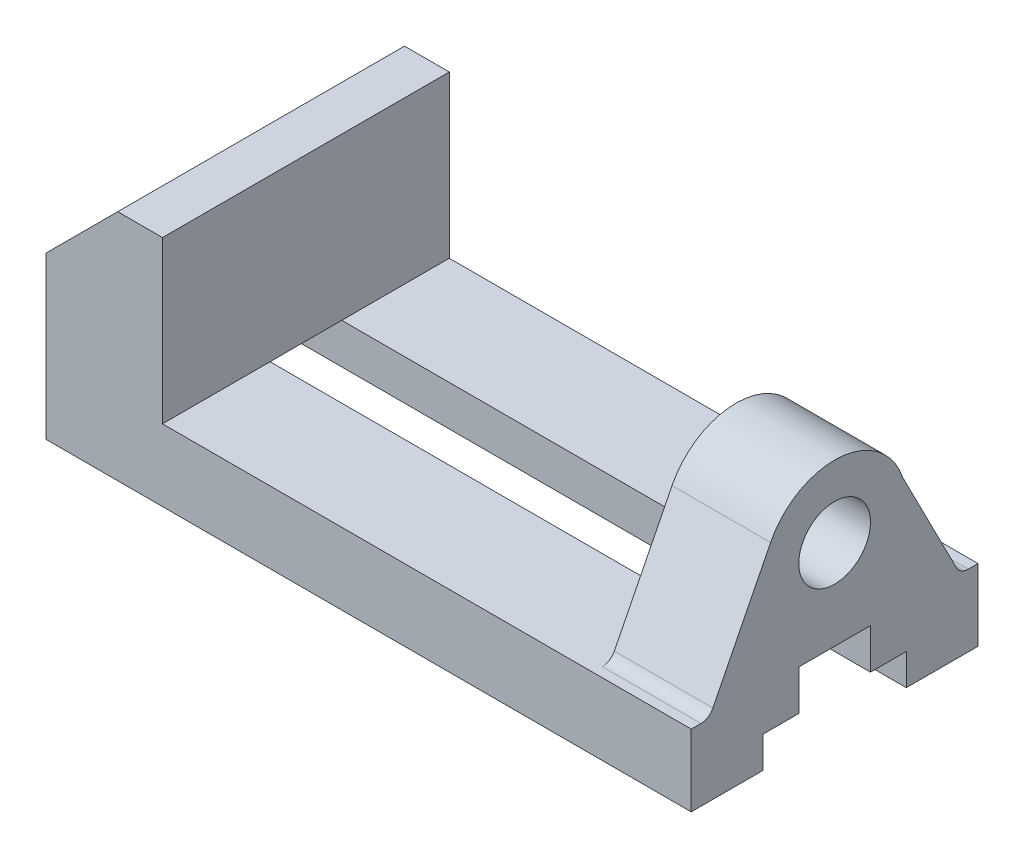
ISO-10303-21;
HEADER;
FILE_DESCRIPTION(('STEP AP214'),'2;1');
FILE_NAME('part.step','',(''),(''),'','','');
FILE_SCHEMA(('AUTOMOTIVE_DESIGN { 1 0 10303 214 1 1 1 1 }'));
ENDSEC;
DATA;
#1=APPLICATION_CONTEXT('core data for automotive mechanical design processes');
#2=APPLICATION_PROTOCOL_DEFINITION('international standard','automotive_design',2000,#1);
#3=PRODUCT_CONTEXT('',#1,'mechanical');
#4=PRODUCT('Part','Part','',(#3));
#5=PRODUCT_RELATED_PRODUCT_CATEGORY('part','',(#4));
#6=PRODUCT_DEFINITION_FORMATION('','',#4);
#7=PRODUCT_DEFINITION_CONTEXT('part definition',#1,'design');
#8=PRODUCT_DEFINITION('design','',#6,#7);
#9=PRODUCT_DEFINITION_SHAPE('','',#8);
#10=(LENGTH_UNIT() NAMED_UNIT(*) SI_UNIT(.MILLI.,.METRE.));
#11=(NAMED_UNIT(*) PLANE_ANGLE_UNIT() SI_UNIT($,.RADIAN.));
#12=(NAMED_UNIT(*) SI_UNIT($,.STERADIAN.) SOLID_ANGLE_UNIT());
#13=UNCERTAINTY_MEASURE_WITH_UNIT(LENGTH_MEASURE(1.E-05),#10,'distance_accuracy_value','');
#14=(GEOMETRIC_REPRESENTATION_CONTEXT(3) GLOBAL_UNCERTAINTY_ASSIGNED_CONTEXT((#13)) GLOBAL_UNIT_ASSIGNED_CONTEXT((#10,
#11,#12)) REPRESENTATION_CONTEXT('',''));
#15=CARTESIAN_POINT('',(0.,0.,0.));
#16=DIRECTION('',(0.,0.,1.));
#17=DIRECTION('',(1.,0.,0.));
#18=AXIS2_PLACEMENT_3D('',#15,#16,#17);
#19=CARTESIAN_POINT('',(-72.,-26.,64.));
#20=DIRECTION('',(0.,1.,0.));
#21=DIRECTION('',(0.,0.,1.));
#22=AXIS2_PLACEMENT_3D('',#19,#20,#21);
#23=PLANE('',#22);
#24=CARTESIAN_POINT('',(-36.,-26.,56.));
#25=DIRECTION('',(0.,-1.,0.));
#26=DIRECTION('',(0.,0.,-1.));
#27=AXIS2_PLACEMENT_3D('',#24,#25,#26);
#28=CIRCLE('',#27,2.99999999999999);
#29=CARTESIAN_POINT('',(-36.,-26.,53.));
#30=VERTEX_POINT('',#29);
#31=EDGE_CURVE('E260',#30,#30,#28,.T.);
#32=ORIENTED_EDGE('',*,*,#31,.F.);
#33=EDGE_LOOP('',(#32));
#34=FACE_BOUND('',#33,.T.);
#35=CARTESIAN_POINT('',(34.,-26.,56.));
#36=DIRECTION('',(0.,-1.,0.));
#37=DIRECTION('',(0.,0.,-1.));
#38=AXIS2_PLACEMENT_3D('',#35,#36,#37);
#39=CIRCLE('',#38,2.99999999999999);
#40=CARTESIAN_POINT('',(34.,-26.,53.));
#41=VERTEX_POINT('',#40);
#42=EDGE_CURVE('E266',#41,#41,#39,.T.);
#43=ORIENTED_EDGE('',*,*,#42,.F.);
#44=EDGE_LOOP('',(#43));
#45=FACE_BOUND('',#44,.T.);
#46=DIRECTION('',(1.,0.,0.));
#47=VECTOR('',#46,1.);
#48=CARTESIAN_POINT('',(-72.,-26.,48.));
#49=LINE('',#48,#47);
#50=CARTESIAN_POINT('',(-72.,-26.,48.));
#51=VERTEX_POINT('',#50);
#52=CARTESIAN_POINT('',(72.,-26.,48.));
#53=VERTEX_POINT('',#52);
#54=EDGE_CURVE('E331',#51,#53,#49,.T.);
#55=ORIENTED_EDGE('',*,*,#54,.T.);
#56=DIRECTION('',(0.,0.,-1.));
#57=VECTOR('',#56,1.);
#58=CARTESIAN_POINT('',(72.,-26.,64.));
#59=LINE('',#58,#57);
#60=CARTESIAN_POINT('',(72.,-26.,64.));
#61=VERTEX_POINT('',#60);
#62=EDGE_CURVE('E411',#61,#53,#59,.T.);
#63=ORIENTED_EDGE('',*,*,#62,.F.);
#64=DIRECTION('',(1.,0.,0.));
#65=VECTOR('',#64,1.);
#66=CARTESIAN_POINT('',(-72.,-26.,64.));
#67=LINE('',#66,#65);
#68=CARTESIAN_POINT('',(-72.,-26.,64.));
#69=VERTEX_POINT('',#68);
#70=EDGE_CURVE('E399',#69,#61,#67,.T.);
#71=ORIENTED_EDGE('',*,*,#70,.F.);
#72=DIRECTION('',(0.,0.,-1.));
#73=VECTOR('',#72,1.);
#74=CARTESIAN_POINT('',(-72.,-26.,64.));
#75=LINE('',#74,#73);
#76=EDGE_CURVE('E415',#69,#51,#75,.T.);
#77=ORIENTED_EDGE('',*,*,#76,.T.);
#78=EDGE_LOOP('',(#55,#63,#71,#77));
#79=FACE_BOUND('',#78,.T.);
#80=ADVANCED_FACE('F74',(#34,#45,#79),#23,.F.);
#81=CARTESIAN_POINT('',(-46.,-10.,0.));
#82=DIRECTION('',(0.,-1.,0.));
#83=DIRECTION('',(0.,0.,-1.));
#84=AXIS2_PLACEMENT_3D('',#81,#82,#83);
#85=PLANE('',#84);
#86=DIRECTION('',(0.,0.,1.));
#87=VECTOR('',#86,1.);
#88=CARTESIAN_POINT('',(50.,-10.,0.));
#89=LINE('',#88,#87);
#90=CARTESIAN_POINT('',(50.,-10.,2.1648257707599));
#91=VERTEX_POINT('',#90);
#92=CARTESIAN_POINT('',(50.,-9.99999999999999,24.));
#93=VERTEX_POINT('',#92);
#94=EDGE_CURVE('E380',#91,#93,#89,.T.);
#95=ORIENTED_EDGE('',*,*,#94,.F.);
#96=DIRECTION('',(1.,0.,0.));
#97=VECTOR('',#96,1.);
#98=CARTESIAN_POINT('',(-46.,-10.,2.1648257707599));
#99=LINE('',#98,#97);
#100=CARTESIAN_POINT('',(72.,-9.99999999999851,2.1648257707599));
#101=VERTEX_POINT('',#100);
#102=EDGE_CURVE('E421',#91,#101,#99,.T.);
#103=ORIENTED_EDGE('',*,*,#102,.T.);
#104=DIRECTION('',(0.,0.,1.));
#105=VECTOR('',#104,1.);
#106=CARTESIAN_POINT('',(72.,-9.99999999999851,0.));
#107=LINE('',#106,#105);
#108=CARTESIAN_POINT('',(72.,-9.99999999999851,0.));
#109=VERTEX_POINT('',#108);
#110=EDGE_CURVE('E361',#109,#101,#107,.T.);
#111=ORIENTED_EDGE('',*,*,#110,.F.);
#112=DIRECTION('',(1.,0.,0.));
#113=VECTOR('',#112,1.);
#114=CARTESIAN_POINT('',(-46.,-10.,0.));
#115=LINE('',#114,#113);
#116=CARTESIAN_POINT('',(-46.,-10.,0.));
#117=VERTEX_POINT('',#116);
#118=EDGE_CURVE('E373',#117,#109,#115,.T.);
#119=ORIENTED_EDGE('',*,*,#118,.F.);
#120=DIRECTION('',(0.,0.,1.));
#121=VECTOR('',#120,1.);
#122=CARTESIAN_POINT('',(-46.,-10.,0.));
#123=LINE('',#122,#121);
#124=CARTESIAN_POINT('',(-46.,-10.,24.));
#125=VERTEX_POINT('',#124);
#126=EDGE_CURVE('E384',#117,#125,#123,.T.);
#127=ORIENTED_EDGE('',*,*,#126,.T.);
#128=DIRECTION('',(1.,0.,0.));
#129=VECTOR('',#128,1.);
#130=CARTESIAN_POINT('',(-72.,-9.99999999999999,24.));
#131=LINE('',#130,#129);
#132=EDGE_CURVE('E323',#125,#93,#131,.T.);
#133=ORIENTED_EDGE('',*,*,#132,.T.);
#134=EDGE_LOOP('',(#95,#103,#111,#119,#127,#133));
#135=FACE_BOUND('',#134,.T.);
#136=ADVANCED_FACE('F447',(#135),#85,.F.);
#137=CARTESIAN_POINT('',(72.,26.,64.));
#138=DIRECTION('',(-1.,0.,0.));
#139=DIRECTION('',(0.,0.,1.));
#140=AXIS2_PLACEMENT_3D('',#137,#138,#139);
#141=PLANE('',#140);
#142=DIRECTION('',(0.,0.,1.));
#143=VECTOR('',#142,1.);
#144=CARTESIAN_POINT('',(72.,-19.,0.));
#145=LINE('',#144,#143);
#146=CARTESIAN_POINT('',(72.,-19.,16.));
#147=VERTEX_POINT('',#146);
#148=CARTESIAN_POINT('',(72.,-19.,24.));
#149=VERTEX_POINT('',#148);
#150=EDGE_CURVE('E312',#147,#149,#145,.T.);
#151=ORIENTED_EDGE('',*,*,#150,.F.);
#152=DIRECTION('',(0.,1.,0.));
#153=VECTOR('',#152,1.);
#154=CARTESIAN_POINT('',(72.,0.,16.));
#155=LINE('',#154,#153);
#156=CARTESIAN_POINT('',(72.,-26.,16.));
#157=VERTEX_POINT('',#156);
#158=EDGE_CURVE('E315',#157,#147,#155,.T.);
#159=ORIENTED_EDGE('',*,*,#158,.F.);
#160=CARTESIAN_POINT('',(72.,-26.,0.));
#161=VERTEX_POINT('',#160);
#162=EDGE_CURVE('E401',#157,#161,#59,.T.);
#163=ORIENTED_EDGE('',*,*,#162,.T.);
#164=DIRECTION('',(0.,1.,0.));
#165=VECTOR('',#164,1.);
#166=CARTESIAN_POINT('',(72.,26.,0.));
#167=LINE('',#166,#165);
#168=EDGE_CURVE('E383',#161,#109,#167,.T.);
#169=ORIENTED_EDGE('',*,*,#168,.T.);
#170=ORIENTED_EDGE('',*,*,#110,.T.);
#171=CARTESIAN_POINT('',(72.,-7.,2.1648257707599));
#172=DIRECTION('',(-1.,0.,0.));
#173=DIRECTION('',(0.,0.,1.));
#174=AXIS2_PLACEMENT_3D('',#171,#172,#173);
#175=CIRCLE('',#174,3.);
#176=CARTESIAN_POINT('',(72.,-8.36615393147599,4.83571016277553));
#177=VERTEX_POINT('',#176);
#178=EDGE_CURVE('E433',#101,#177,#175,.T.);
#179=ORIENTED_EDGE('',*,*,#178,.T.);
#180=DIRECTION('',(0.,0.890294797338543,0.455384643825331));
#181=VECTOR('',#180,1.);
#182=CARTESIAN_POINT('',(72.,-3.69545805507138,7.22476509654726));
#183=LINE('',#182,#181);
#184=CARTESIAN_POINT('',(72.,15.0770580004035,16.8268829154802));
#185=VERTEX_POINT('',#184);
#186=EDGE_CURVE('E359',#177,#185,#183,.T.);
#187=ORIENTED_EDGE('',*,*,#186,.T.);
#188=CARTESIAN_POINT('',(72.,10.0000000000116,31.9999999999906));
#189=DIRECTION('',(1.,0.,0.));
#190=DIRECTION('',(0.,0.,-1.));
#191=AXIS2_PLACEMENT_3D('',#188,#189,#190);
#192=CIRCLE('',#191,15.9999999999876);
#193=CARTESIAN_POINT('',(72.,17.2022511872648,46.2873222765874));
#194=VERTEX_POINT('',#193);
#195=EDGE_CURVE('E356',#185,#194,#192,.T.);
#196=ORIENTED_EDGE('',*,*,#195,.T.);
#197=DIRECTION('',(0.,0.892957642287946,-0.450140699203651));
#198=VECTOR('',#197,1.);
#199=CARTESIAN_POINT('',(72.,22.091128156727,43.8228352806357));
#200=LINE('',#199,#198);
#201=CARTESIAN_POINT('',(72.,-8.35042209761096,59.1684463907224));
#202=VERTEX_POINT('',#201);
#203=EDGE_CURVE('E346',#202,#194,#200,.T.);
#204=ORIENTED_EDGE('',*,*,#203,.F.);
#205=CARTESIAN_POINT('',(72.,-7.,61.8473193175863));
#206=DIRECTION('',(-1.,0.,0.));
#207=DIRECTION('',(0.,0.,1.));
#208=AXIS2_PLACEMENT_3D('',#205,#206,#207);
#209=CIRCLE('',#208,3.);
#210=CARTESIAN_POINT('',(72.,-9.99999999999852,61.8473193175863));
#211=VERTEX_POINT('',#210);
#212=EDGE_CURVE('E82',#202,#211,#209,.T.);
#213=ORIENTED_EDGE('',*,*,#212,.T.);
#214=DIRECTION('',(0.,0.,-1.));
#215=VECTOR('',#214,1.);
#216=CARTESIAN_POINT('',(72.,-9.99999999999852,0.));
#217=LINE('',#216,#215);
#218=CARTESIAN_POINT('',(72.,-9.99999999999852,64.));
#219=VERTEX_POINT('',#218);
#220=EDGE_CURVE('E348',#219,#211,#217,.T.);
#221=ORIENTED_EDGE('',*,*,#220,.F.);
#222=DIRECTION('',(0.,1.,0.));
#223=VECTOR('',#222,1.);
#224=CARTESIAN_POINT('',(72.,26.,64.));
#225=LINE('',#224,#223);
#226=EDGE_CURVE('E390',#61,#219,#225,.T.);
#227=ORIENTED_EDGE('',*,*,#226,.F.);
#228=ORIENTED_EDGE('',*,*,#62,.T.);
#229=DIRECTION('',(0.,1.,0.));
#230=VECTOR('',#229,1.);
#231=CARTESIAN_POINT('',(72.,0.,48.));
#232=LINE('',#231,#230);
#233=CARTESIAN_POINT('',(72.,-19.,48.));
#234=VERTEX_POINT('',#233);
#235=EDGE_CURVE('E311',#53,#234,#232,.T.);
#236=ORIENTED_EDGE('',*,*,#235,.T.);
#237=CARTESIAN_POINT('',(72.,-19.,40.));
#238=VERTEX_POINT('',#237);
#239=EDGE_CURVE('E308',#238,#234,#145,.T.);
#240=ORIENTED_EDGE('',*,*,#239,.F.);
#241=DIRECTION('',(0.,-1.,0.));
#242=VECTOR('',#241,1.);
#243=CARTESIAN_POINT('',(72.,0.,40.));
#244=LINE('',#243,#242);
#245=CARTESIAN_POINT('',(72.,-9.99999999999999,40.));
#246=VERTEX_POINT('',#245);
#247=EDGE_CURVE('E305',#246,#238,#244,.T.);
#248=ORIENTED_EDGE('',*,*,#247,.F.);
#249=DIRECTION('',(0.,0.,1.));
#250=VECTOR('',#249,1.);
#251=CARTESIAN_POINT('',(72.,-9.99999999999999,0.));
#252=LINE('',#251,#250);
#253=CARTESIAN_POINT('',(72.,-9.99999999999999,24.));
#254=VERTEX_POINT('',#253);
#255=EDGE_CURVE('E281',#254,#246,#252,.T.);
#256=ORIENTED_EDGE('',*,*,#255,.F.);
#257=DIRECTION('',(0.,1.,0.));
#258=VECTOR('',#257,1.);
#259=CARTESIAN_POINT('',(72.,0.,24.));
#260=LINE('',#259,#258);
#261=EDGE_CURVE('E287',#149,#254,#260,.T.);
#262=ORIENTED_EDGE('',*,*,#261,.F.);
#263=EDGE_LOOP('',(#151,#159,#163,#169,#170,#179,#187,#196,#204,#213,#221,#227,#228,#236,#240,
#248,#256,#262));
#264=FACE_BOUND('',#263,.T.);
#265=CARTESIAN_POINT('',(72.,10.0000000000116,31.9999999999906));
#266=DIRECTION('',(1.,0.,0.));
#267=DIRECTION('',(0.,0.,-1.));
#268=AXIS2_PLACEMENT_3D('',#265,#266,#267);
#269=CIRCLE('',#268,7.99999999998763);
#270=CARTESIAN_POINT('',(72.,10.0000000000116,24.000000000003));
#271=VERTEX_POINT('',#270);
#272=EDGE_CURVE('E343',#271,#271,#269,.T.);
#273=ORIENTED_EDGE('',*,*,#272,.F.);
#274=EDGE_LOOP('',(#273));
#275=FACE_BOUND('',#274,.T.);
#276=ADVANCED_FACE('F450',(#264,#275),#141,.F.);
#277=CARTESIAN_POINT('',(0.,0.,0.));
#278=DIRECTION('',(0.,0.,1.));
#279=DIRECTION('',(1.,0.,0.));
#280=AXIS2_PLACEMENT_3D('',#277,#278,#279);
#281=PLANE('',#280);
#282=DIRECTION('',(0.,-1.,0.));
#283=VECTOR('',#282,1.);
#284=CARTESIAN_POINT('',(-72.,26.,0.));
#285=LINE('',#284,#283);
#286=CARTESIAN_POINT('',(-72.,9.99999999999999,0.));
#287=VERTEX_POINT('',#286);
#288=CARTESIAN_POINT('',(-72.,-26.,0.));
#289=VERTEX_POINT('',#288);
#290=EDGE_CURVE('E407',#287,#289,#285,.T.);
#291=ORIENTED_EDGE('',*,*,#290,.F.);
#292=DIRECTION('',(0.707106781186547,0.707106781186548,0.));
#293=VECTOR('',#292,1.);
#294=CARTESIAN_POINT('',(-72.,9.99999999999999,0.));
#295=LINE('',#294,#293);
#296=CARTESIAN_POINT('',(-56.,26.,0.));
#297=VERTEX_POINT('',#296);
#298=EDGE_CURVE('E273',#287,#297,#295,.T.);
#299=ORIENTED_EDGE('',*,*,#298,.T.);
#300=DIRECTION('',(-1.,0.,0.));
#301=VECTOR('',#300,1.);
#302=CARTESIAN_POINT('',(-72.,26.,0.));
#303=LINE('',#302,#301);
#304=CARTESIAN_POINT('',(-46.,26.,0.));
#305=VERTEX_POINT('',#304);
#306=EDGE_CURVE('E404',#305,#297,#303,.T.);
#307=ORIENTED_EDGE('',*,*,#306,.F.);
#308=DIRECTION('',(0.,-1.,0.));
#309=VECTOR('',#308,1.);
#310=CARTESIAN_POINT('',(-46.,26.,0.));
#311=LINE('',#310,#309);
#312=EDGE_CURVE('E370',#305,#117,#311,.T.);
#313=ORIENTED_EDGE('',*,*,#312,.T.);
#314=ORIENTED_EDGE('',*,*,#118,.T.);
#315=ORIENTED_EDGE('',*,*,#168,.F.);
#316=DIRECTION('',(1.,0.,0.));
#317=VECTOR('',#316,1.);
#318=CARTESIAN_POINT('',(-72.,-26.,0.));
#319=LINE('',#318,#317);
#320=EDGE_CURVE('E394',#289,#161,#319,.T.);
#321=ORIENTED_EDGE('',*,*,#320,.F.);
#322=EDGE_LOOP('',(#291,#299,#307,#313,#314,#315,#321));
#323=FACE_BOUND('',#322,.T.);
#324=ADVANCED_FACE('F459',(#323),#281,.F.);
#325=CARTESIAN_POINT('',(50.,-10.,0.));
#326=DIRECTION('',(1.,0.,0.));
#327=DIRECTION('',(0.,0.,-1.));
#328=AXIS2_PLACEMENT_3D('',#325,#326,#327);
#329=PLANE('',#328);
#330=CARTESIAN_POINT('',(50.,10.0000000000116,31.9999999999906));
#331=DIRECTION('',(1.,0.,0.));
#332=DIRECTION('',(0.,0.,-1.));
#333=AXIS2_PLACEMENT_3D('',#330,#331,#332);
#334=CIRCLE('',#333,7.99999999998763);
#335=CARTESIAN_POINT('',(50.,10.0000000000116,24.000000000003));
#336=VERTEX_POINT('',#335);
#337=EDGE_CURVE('E355',#336,#336,#334,.T.);
#338=ORIENTED_EDGE('',*,*,#337,.T.);
#339=EDGE_LOOP('',(#338));
#340=FACE_BOUND('',#339,.T.);
#341=ORIENTED_EDGE('',*,*,#94,.T.);
#342=DIRECTION('',(0.,0.,1.));
#343=VECTOR('',#342,1.);
#344=CARTESIAN_POINT('',(50.,-10.,0.));
#345=LINE('',#344,#343);
#346=CARTESIAN_POINT('',(50.,-9.99999999999999,40.));
#347=VERTEX_POINT('',#346);
#348=EDGE_CURVE('E322',#93,#347,#345,.T.);
#349=ORIENTED_EDGE('',*,*,#348,.T.);
#350=CARTESIAN_POINT('',(50.,-10.,61.8473193175863));
#351=VERTEX_POINT('',#350);
#352=EDGE_CURVE('E88',#347,#351,#89,.T.);
#353=ORIENTED_EDGE('',*,*,#352,.T.);
#354=CARTESIAN_POINT('',(50.,-7.,61.8473193175863));
#355=DIRECTION('',(1.,0.,0.));
#356=DIRECTION('',(0.,0.,-1.));
#357=AXIS2_PLACEMENT_3D('',#354,#355,#356);
#358=CIRCLE('',#357,3.);
#359=CARTESIAN_POINT('',(50.,-8.35042209761095,59.1684463907224));
#360=VERTEX_POINT('',#359);
#361=EDGE_CURVE('E12',#351,#360,#358,.T.);
#362=ORIENTED_EDGE('',*,*,#361,.T.);
#363=DIRECTION('',(0.,0.892957642287946,-0.450140699203651));
#364=VECTOR('',#363,1.);
#365=CARTESIAN_POINT('',(50.,14.1173946475225,47.8424010552231));
#366=LINE('',#365,#364);
#367=CARTESIAN_POINT('',(50.,17.2022511872648,46.2873222765874));
#368=VERTEX_POINT('',#367);
#369=EDGE_CURVE('E353',#360,#368,#366,.T.);
#370=ORIENTED_EDGE('',*,*,#369,.T.);
#371=CARTESIAN_POINT('',(50.,10.0000000000116,31.9999999999906));
#372=DIRECTION('',(1.,0.,0.));
#373=DIRECTION('',(0.,0.,-1.));
#374=AXIS2_PLACEMENT_3D('',#371,#372,#373);
#375=CIRCLE('',#374,15.9999999999876);
#376=CARTESIAN_POINT('',(50.,15.0770580004035,16.8268829154802));
#377=VERTEX_POINT('',#376);
#378=EDGE_CURVE('E418',#377,#368,#375,.T.);
#379=ORIENTED_EDGE('',*,*,#378,.F.);
#380=DIRECTION('',(0.,0.890294797338543,0.455384643825331));
#381=VECTOR('',#380,1.);
#382=CARTESIAN_POINT('',(50.,-11.6217063167521,3.17049930469169));
#383=LINE('',#382,#381);
#384=CARTESIAN_POINT('',(50.,-8.36615393147599,4.83571016277553));
#385=VERTEX_POINT('',#384);
#386=EDGE_CURVE('E367',#385,#377,#383,.T.);
#387=ORIENTED_EDGE('',*,*,#386,.F.);
#388=CARTESIAN_POINT('',(50.,-7.,2.1648257707599));
#389=DIRECTION('',(1.,0.,0.));
#390=DIRECTION('',(0.,0.,-1.));
#391=AXIS2_PLACEMENT_3D('',#388,#389,#390);
#392=CIRCLE('',#391,3.);
#393=EDGE_CURVE('E435',#385,#91,#392,.T.);
#394=ORIENTED_EDGE('',*,*,#393,.T.);
#395=EDGE_LOOP('',(#341,#349,#353,#362,#370,#379,#387,#394));
#396=FACE_BOUND('',#395,.T.);
#397=ADVANCED_FACE('F440',(#340,#396),#329,.F.);
#398=CARTESIAN_POINT('',(-72.,26.,64.));
#399=DIRECTION('',(0.,-1.,0.));
#400=DIRECTION('',(0.,0.,-1.));
#401=AXIS2_PLACEMENT_3D('',#398,#399,#400);
#402=PLANE('',#401);
#403=ORIENTED_EDGE('',*,*,#306,.T.);
#404=DIRECTION('',(0.,0.,1.));
#405=VECTOR('',#404,1.);
#406=CARTESIAN_POINT('',(-56.,26.,0.));
#407=LINE('',#406,#405);
#408=CARTESIAN_POINT('',(-56.,26.,64.));
#409=VERTEX_POINT('',#408);
#410=EDGE_CURVE('E278',#297,#409,#407,.T.);
#411=ORIENTED_EDGE('',*,*,#410,.T.);
#412=DIRECTION('',(-1.,0.,0.));
#413=VECTOR('',#412,1.);
#414=CARTESIAN_POINT('',(-72.,26.,64.));
#415=LINE('',#414,#413);
#416=CARTESIAN_POINT('',(-46.,26.,64.));
#417=VERTEX_POINT('',#416);
#418=EDGE_CURVE('E393',#417,#409,#415,.T.);
#419=ORIENTED_EDGE('',*,*,#418,.F.);
#420=DIRECTION('',(0.,0.,1.));
#421=VECTOR('',#420,1.);
#422=CARTESIAN_POINT('',(-46.,26.,0.));
#423=LINE('',#422,#421);
#424=EDGE_CURVE('E376',#305,#417,#423,.T.);
#425=ORIENTED_EDGE('',*,*,#424,.F.);
#426=EDGE_LOOP('',(#403,#411,#419,#425));
#427=FACE_BOUND('',#426,.T.);
#428=ADVANCED_FACE('F524',(#427),#402,.F.);
#429=CARTESIAN_POINT('',(-72.,26.,64.));
#430=DIRECTION('',(1.,0.,0.));
#431=DIRECTION('',(0.,0.,-1.));
#432=AXIS2_PLACEMENT_3D('',#429,#430,#431);
#433=PLANE('',#432);
#434=DIRECTION('',(0.,-1.,0.));
#435=VECTOR('',#434,1.);
#436=CARTESIAN_POINT('',(-72.,26.,64.));
#437=LINE('',#436,#435);
#438=CARTESIAN_POINT('',(-72.,10.,64.));
#439=VERTEX_POINT('',#438);
#440=EDGE_CURVE('E397',#439,#69,#437,.T.);
#441=ORIENTED_EDGE('',*,*,#440,.F.);
#442=DIRECTION('',(0.,0.,1.));
#443=VECTOR('',#442,1.);
#444=CARTESIAN_POINT('',(-72.,9.99999999999999,0.));
#445=LINE('',#444,#443);
#446=EDGE_CURVE('E276',#287,#439,#445,.T.);
#447=ORIENTED_EDGE('',*,*,#446,.F.);
#448=ORIENTED_EDGE('',*,*,#290,.T.);
#449=CARTESIAN_POINT('',(-72.,-26.,16.));
#450=VERTEX_POINT('',#449);
#451=EDGE_CURVE('E414',#450,#289,#75,.T.);
#452=ORIENTED_EDGE('',*,*,#451,.F.);
#453=DIRECTION('',(0.,1.,0.));
#454=VECTOR('',#453,1.);
#455=CARTESIAN_POINT('',(-72.,0.,16.));
#456=LINE('',#455,#454);
#457=CARTESIAN_POINT('',(-72.,-19.,16.));
#458=VERTEX_POINT('',#457);
#459=EDGE_CURVE('E296',#450,#458,#456,.T.);
#460=ORIENTED_EDGE('',*,*,#459,.T.);
#461=DIRECTION('',(0.,0.,1.));
#462=VECTOR('',#461,1.);
#463=CARTESIAN_POINT('',(-72.,-19.,0.));
#464=LINE('',#463,#462);
#465=CARTESIAN_POINT('',(-72.,-19.,24.));
#466=VERTEX_POINT('',#465);
#467=EDGE_CURVE('E294',#458,#466,#464,.T.);
#468=ORIENTED_EDGE('',*,*,#467,.T.);
#469=DIRECTION('',(0.,1.,0.));
#470=VECTOR('',#469,1.);
#471=CARTESIAN_POINT('',(-72.,0.,24.));
#472=LINE('',#471,#470);
#473=CARTESIAN_POINT('',(-72.,-9.99999999999999,24.));
#474=VERTEX_POINT('',#473);
#475=EDGE_CURVE('E299',#466,#474,#472,.T.);
#476=ORIENTED_EDGE('',*,*,#475,.T.);
#477=DIRECTION('',(0.,0.,1.));
#478=VECTOR('',#477,1.);
#479=CARTESIAN_POINT('',(-72.,-9.99999999999999,0.));
#480=LINE('',#479,#478);
#481=CARTESIAN_POINT('',(-72.,-9.99999999999999,40.));
#482=VERTEX_POINT('',#481);
#483=EDGE_CURVE('E283',#474,#482,#480,.T.);
#484=ORIENTED_EDGE('',*,*,#483,.T.);
#485=DIRECTION('',(0.,-1.,0.));
#486=VECTOR('',#485,1.);
#487=CARTESIAN_POINT('',(-72.,0.,40.));
#488=LINE('',#487,#486);
#489=CARTESIAN_POINT('',(-72.,-19.,40.));
#490=VERTEX_POINT('',#489);
#491=EDGE_CURVE('E286',#482,#490,#488,.T.);
#492=ORIENTED_EDGE('',*,*,#491,.T.);
#493=CARTESIAN_POINT('',(-72.,-19.,48.));
#494=VERTEX_POINT('',#493);
#495=EDGE_CURVE('E290',#490,#494,#464,.T.);
#496=ORIENTED_EDGE('',*,*,#495,.T.);
#497=DIRECTION('',(0.,1.,0.));
#498=VECTOR('',#497,1.);
#499=CARTESIAN_POINT('',(-72.,0.,48.));
#500=LINE('',#499,#498);
#501=EDGE_CURVE('E293',#51,#494,#500,.T.);
#502=ORIENTED_EDGE('',*,*,#501,.F.);
#503=ORIENTED_EDGE('',*,*,#76,.F.);
#504=EDGE_LOOP('',(#441,#447,#448,#452,#460,#468,#476,#484,#492,#496,#502,#503));
#505=FACE_BOUND('',#504,.T.);
#506=ADVANCED_FACE('F517',(#505),#433,.F.);
#507=CARTESIAN_POINT('',(-36.,-26.,8.));
#508=DIRECTION('',(0.,-1.,0.));
#509=DIRECTION('',(0.,0.,-1.));
#510=AXIS2_PLACEMENT_3D('',#507,#508,#509);
#511=CIRCLE('',#510,2.99999999999999);
#512=CARTESIAN_POINT('',(-36.,-26.,5.00000000000001));
#513=VERTEX_POINT('',#512);
#514=EDGE_CURVE('E250',#513,#513,#511,.T.);
#515=ORIENTED_EDGE('',*,*,#514,.F.);
#516=EDGE_LOOP('',(#515));
#517=FACE_BOUND('',#516,.T.);
#518=CARTESIAN_POINT('',(34.,-26.,8.));
#519=DIRECTION('',(0.,-1.,0.));
#520=DIRECTION('',(0.,0.,-1.));
#521=AXIS2_PLACEMENT_3D('',#518,#519,#520);
#522=CIRCLE('',#521,2.99999999999999);
#523=CARTESIAN_POINT('',(34.,-26.,5.00000000000001));
#524=VERTEX_POINT('',#523);
#525=EDGE_CURVE('E249',#524,#524,#522,.T.);
#526=ORIENTED_EDGE('',*,*,#525,.F.);
#527=EDGE_LOOP('',(#526));
#528=FACE_BOUND('',#527,.T.);
#529=ORIENTED_EDGE('',*,*,#162,.F.);
#530=DIRECTION('',(1.,0.,0.));
#531=VECTOR('',#530,1.);
#532=CARTESIAN_POINT('',(-72.,-26.,16.));
#533=LINE('',#532,#531);
#534=EDGE_CURVE('E329',#450,#157,#533,.T.);
#535=ORIENTED_EDGE('',*,*,#534,.F.);
#536=ORIENTED_EDGE('',*,*,#451,.T.);
#537=ORIENTED_EDGE('',*,*,#320,.T.);
#538=EDGE_LOOP('',(#529,#535,#536,#537));
#539=FACE_BOUND('',#538,.T.);
#540=ADVANCED_FACE('F507',(#517,#528,#539),#23,.F.);
#541=CARTESIAN_POINT('',(0.,0.,64.));
#542=DIRECTION('',(0.,0.,1.));
#543=DIRECTION('',(1.,0.,0.));
#544=AXIS2_PLACEMENT_3D('',#541,#542,#543);
#545=PLANE('',#544);
#546=DIRECTION('',(0.707106781186547,0.707106781186548,0.));
#547=VECTOR('',#546,1.);
#548=CARTESIAN_POINT('',(-72.,9.99999999999999,64.));
#549=LINE('',#548,#547);
#550=EDGE_CURVE('E272',#439,#409,#549,.T.);
#551=ORIENTED_EDGE('',*,*,#550,.F.);
#552=ORIENTED_EDGE('',*,*,#440,.T.);
#553=ORIENTED_EDGE('',*,*,#70,.T.);
#554=ORIENTED_EDGE('',*,*,#226,.T.);
#555=DIRECTION('',(1.,0.,0.));
#556=VECTOR('',#555,1.);
#557=CARTESIAN_POINT('',(-46.,-10.,64.));
#558=LINE('',#557,#556);
#559=CARTESIAN_POINT('',(-46.,-10.,64.));
#560=VERTEX_POINT('',#559);
#561=EDGE_CURVE('E374',#560,#219,#558,.T.);
#562=ORIENTED_EDGE('',*,*,#561,.F.);
#563=DIRECTION('',(0.,-1.,0.));
#564=VECTOR('',#563,1.);
#565=CARTESIAN_POINT('',(-46.,26.,64.));
#566=LINE('',#565,#564);
#567=EDGE_CURVE('E369',#417,#560,#566,.T.);
#568=ORIENTED_EDGE('',*,*,#567,.F.);
#569=ORIENTED_EDGE('',*,*,#418,.T.);
#570=EDGE_LOOP('',(#551,#552,#553,#554,#562,#568,#569));
#571=FACE_BOUND('',#570,.T.);
#572=ADVANCED_FACE('F477',(#571),#545,.T.);
#573=ORIENTED_EDGE('',*,*,#220,.T.);
#574=DIRECTION('',(1.,0.,0.));
#575=VECTOR('',#574,1.);
#576=CARTESIAN_POINT('',(50.,-10.,61.8473193175863));
#577=LINE('',#576,#575);
#578=EDGE_CURVE('E431',#211,#351,#577,.F.);
#579=ORIENTED_EDGE('',*,*,#578,.T.);
#580=ORIENTED_EDGE('',*,*,#352,.F.);
#581=DIRECTION('',(1.,0.,0.));
#582=VECTOR('',#581,1.);
#583=CARTESIAN_POINT('',(-72.,-9.99999999999999,40.));
#584=LINE('',#583,#582);
#585=CARTESIAN_POINT('',(-46.,-9.99999999999999,40.));
#586=VERTEX_POINT('',#585);
#587=EDGE_CURVE('E341',#586,#347,#584,.T.);
#588=ORIENTED_EDGE('',*,*,#587,.F.);
#589=EDGE_CURVE('E388',#586,#560,#123,.T.);
#590=ORIENTED_EDGE('',*,*,#589,.T.);
#591=ORIENTED_EDGE('',*,*,#561,.T.);
#592=EDGE_LOOP('',(#573,#579,#580,#588,#590,#591));
#593=FACE_BOUND('',#592,.T.);
#594=ADVANCED_FACE('F470',(#593),#85,.F.);
#595=CARTESIAN_POINT('',(-46.,26.,0.));
#596=DIRECTION('',(-1.,0.,0.));
#597=DIRECTION('',(0.,-1.,0.));
#598=AXIS2_PLACEMENT_3D('',#595,#596,#597);
#599=PLANE('',#598);
#600=ORIENTED_EDGE('',*,*,#567,.T.);
#601=ORIENTED_EDGE('',*,*,#589,.F.);
#602=EDGE_CURVE('E387',#125,#586,#123,.T.);
#603=ORIENTED_EDGE('',*,*,#602,.F.);
#604=ORIENTED_EDGE('',*,*,#126,.F.);
#605=ORIENTED_EDGE('',*,*,#312,.F.);
#606=ORIENTED_EDGE('',*,*,#424,.T.);
#607=EDGE_LOOP('',(#600,#601,#603,#604,#605,#606));
#608=FACE_BOUND('',#607,.T.);
#609=ADVANCED_FACE('F464',(#608),#599,.F.);
#610=CARTESIAN_POINT('',(8.00000000000001,10.0000000000116,31.9999999999906));
#611=DIRECTION('',(1.,0.,0.));
#612=DIRECTION('',(0.,0.,-1.));
#613=AXIS2_PLACEMENT_3D('',#610,#611,#612);
#614=CYLINDRICAL_SURFACE('',#613,15.9999999999876);
#615=ORIENTED_EDGE('',*,*,#378,.T.);
#616=DIRECTION('',(1.,0.,0.));
#617=VECTOR('',#616,1.);
#618=CARTESIAN_POINT('',(8.00000000000001,17.2022511872648,46.2873222765874));
#619=LINE('',#618,#617);
#620=EDGE_CURVE('E350',#368,#194,#619,.T.);
#621=ORIENTED_EDGE('',*,*,#620,.T.);
#622=ORIENTED_EDGE('',*,*,#195,.F.);
#623=DIRECTION('',(1.,0.,0.));
#624=VECTOR('',#623,1.);
#625=CARTESIAN_POINT('',(8.00000000000001,15.0770580004035,16.8268829154802));
#626=LINE('',#625,#624);
#627=EDGE_CURVE('E364',#377,#185,#626,.T.);
#628=ORIENTED_EDGE('',*,*,#627,.F.);
#629=EDGE_LOOP('',(#615,#621,#622,#628));
#630=FACE_BOUND('',#629,.T.);
#631=ADVANCED_FACE('F491',(#630),#614,.T.);
#632=CARTESIAN_POINT('',(8.00000000000001,-3.69545805507138,7.22476509654726));
#633=DIRECTION('',(0.,0.455384643825331,-0.890294797338543));
#634=DIRECTION('',(0.,0.890294797338543,0.455384643825331));
#635=AXIS2_PLACEMENT_3D('',#632,#633,#634);
#636=PLANE('',#635);
#637=ORIENTED_EDGE('',*,*,#186,.F.);
#638=DIRECTION('',(1.,0.,0.));
#639=VECTOR('',#638,1.);
#640=CARTESIAN_POINT('',(8.00000000000001,-8.36615393147599,4.83571016277553));
#641=LINE('',#640,#639);
#642=EDGE_CURVE('E426',#177,#385,#641,.F.);
#643=ORIENTED_EDGE('',*,*,#642,.T.);
#644=ORIENTED_EDGE('',*,*,#386,.T.);
#645=ORIENTED_EDGE('',*,*,#627,.T.);
#646=EDGE_LOOP('',(#637,#643,#644,#645));
#647=FACE_BOUND('',#646,.T.);
#648=ADVANCED_FACE('F494',(#647),#636,.T.);
#649=CARTESIAN_POINT('',(8.00000000000001,22.091128156727,43.8228352806357));
#650=DIRECTION('',(0.,-0.450140699203651,-0.892957642287946));
#651=DIRECTION('',(0.,0.892957642287946,-0.450140699203651));
#652=AXIS2_PLACEMENT_3D('',#649,#650,#651);
#653=PLANE('',#652);
#654=ORIENTED_EDGE('',*,*,#369,.F.);
#655=DIRECTION('',(1.,0.,0.));
#656=VECTOR('',#655,1.);
#657=CARTESIAN_POINT('',(72.,-8.35042209761095,59.1684463907224));
#658=LINE('',#657,#656);
#659=EDGE_CURVE('E428',#360,#202,#658,.T.);
#660=ORIENTED_EDGE('',*,*,#659,.T.);
#661=ORIENTED_EDGE('',*,*,#203,.T.);
#662=ORIENTED_EDGE('',*,*,#620,.F.);
#663=EDGE_LOOP('',(#654,#660,#661,#662));
#664=FACE_BOUND('',#663,.T.);
#665=ADVANCED_FACE('F488',(#664),#653,.F.);
#666=CARTESIAN_POINT('',(8.00000000000001,10.0000000000116,31.9999999999906));
#667=DIRECTION('',(1.,0.,0.));
#668=DIRECTION('',(0.,0.,-1.));
#669=AXIS2_PLACEMENT_3D('',#666,#667,#668);
#670=CYLINDRICAL_SURFACE('',#669,7.99999999998763);
#671=ORIENTED_EDGE('',*,*,#272,.T.);
#672=EDGE_LOOP('',(#671));
#673=FACE_BOUND('',#672,.T.);
#674=ORIENTED_EDGE('',*,*,#337,.F.);
#675=EDGE_LOOP('',(#674));
#676=FACE_BOUND('',#675,.T.);
#677=ADVANCED_FACE('F501',(#673,#676),#670,.F.);
#678=CARTESIAN_POINT('',(-72.,-9.99999999999999,0.));
#679=DIRECTION('',(0.,1.,0.));
#680=DIRECTION('',(0.,0.,1.));
#681=AXIS2_PLACEMENT_3D('',#678,#679,#680);
#682=PLANE('',#681);
#683=EDGE_CURVE('E324',#93,#254,#131,.T.);
#684=ORIENTED_EDGE('',*,*,#683,.T.);
#685=ORIENTED_EDGE('',*,*,#255,.T.);
#686=EDGE_CURVE('E302',#347,#246,#584,.T.);
#687=ORIENTED_EDGE('',*,*,#686,.F.);
#688=ORIENTED_EDGE('',*,*,#348,.F.);
#689=EDGE_LOOP('',(#684,#685,#687,#688));
#690=FACE_BOUND('',#689,.T.);
#691=ADVANCED_FACE('F554',(#690),#682,.F.);
#692=EDGE_CURVE('E338',#482,#586,#584,.T.);
#693=ORIENTED_EDGE('',*,*,#692,.F.);
#694=ORIENTED_EDGE('',*,*,#483,.F.);
#695=EDGE_CURVE('E320',#474,#125,#131,.T.);
#696=ORIENTED_EDGE('',*,*,#695,.T.);
#697=ORIENTED_EDGE('',*,*,#602,.T.);
#698=EDGE_LOOP('',(#693,#694,#696,#697));
#699=FACE_BOUND('',#698,.T.);
#700=ADVANCED_FACE('F582',(#699),#682,.F.);
#701=CARTESIAN_POINT('',(-72.,0.,24.));
#702=DIRECTION('',(0.,0.,-1.));
#703=DIRECTION('',(-1.,0.,0.));
#704=AXIS2_PLACEMENT_3D('',#701,#702,#703);
#705=PLANE('',#704);
#706=ORIENTED_EDGE('',*,*,#261,.T.);
#707=ORIENTED_EDGE('',*,*,#683,.F.);
#708=ORIENTED_EDGE('',*,*,#132,.F.);
#709=ORIENTED_EDGE('',*,*,#695,.F.);
#710=ORIENTED_EDGE('',*,*,#475,.F.);
#711=DIRECTION('',(1.,0.,0.));
#712=VECTOR('',#711,1.);
#713=CARTESIAN_POINT('',(-72.,-19.,24.));
#714=LINE('',#713,#712);
#715=EDGE_CURVE('E325',#466,#149,#714,.T.);
#716=ORIENTED_EDGE('',*,*,#715,.T.);
#717=EDGE_LOOP('',(#706,#707,#708,#709,#710,#716));
#718=FACE_BOUND('',#717,.T.);
#719=ADVANCED_FACE('F559',(#718),#705,.F.);
#720=CARTESIAN_POINT('',(-72.,-19.,0.));
#721=DIRECTION('',(0.,1.,0.));
#722=DIRECTION('',(0.,0.,1.));
#723=AXIS2_PLACEMENT_3D('',#720,#721,#722);
#724=PLANE('',#723);
#725=ORIENTED_EDGE('',*,*,#150,.T.);
#726=ORIENTED_EDGE('',*,*,#715,.F.);
#727=ORIENTED_EDGE('',*,*,#467,.F.);
#728=DIRECTION('',(1.,0.,0.));
#729=VECTOR('',#728,1.);
#730=CARTESIAN_POINT('',(-72.,-19.,16.));
#731=LINE('',#730,#729);
#732=EDGE_CURVE('E327',#458,#147,#731,.T.);
#733=ORIENTED_EDGE('',*,*,#732,.T.);
#734=EDGE_LOOP('',(#725,#726,#727,#733));
#735=FACE_BOUND('',#734,.T.);
#736=ADVANCED_FACE('F564',(#735),#724,.F.);
#737=CARTESIAN_POINT('',(-72.,0.,16.));
#738=DIRECTION('',(0.,0.,-1.));
#739=DIRECTION('',(-1.,0.,0.));
#740=AXIS2_PLACEMENT_3D('',#737,#738,#739);
#741=PLANE('',#740);
#742=ORIENTED_EDGE('',*,*,#158,.T.);
#743=ORIENTED_EDGE('',*,*,#732,.F.);
#744=ORIENTED_EDGE('',*,*,#459,.F.);
#745=ORIENTED_EDGE('',*,*,#534,.T.);
#746=EDGE_LOOP('',(#742,#743,#744,#745));
#747=FACE_BOUND('',#746,.T.);
#748=ADVANCED_FACE('F566',(#747),#741,.F.);
#749=CARTESIAN_POINT('',(-72.,0.,48.));
#750=DIRECTION('',(0.,0.,-1.));
#751=DIRECTION('',(-1.,0.,0.));
#752=AXIS2_PLACEMENT_3D('',#749,#750,#751);
#753=PLANE('',#752);
#754=ORIENTED_EDGE('',*,*,#235,.F.);
#755=ORIENTED_EDGE('',*,*,#54,.F.);
#756=ORIENTED_EDGE('',*,*,#501,.T.);
#757=DIRECTION('',(1.,0.,0.));
#758=VECTOR('',#757,1.);
#759=CARTESIAN_POINT('',(-72.,-19.,48.));
#760=LINE('',#759,#758);
#761=EDGE_CURVE('E334',#494,#234,#760,.T.);
#762=ORIENTED_EDGE('',*,*,#761,.T.);
#763=EDGE_LOOP('',(#754,#755,#756,#762));
#764=FACE_BOUND('',#763,.T.);
#765=ADVANCED_FACE('F542',(#764),#753,.T.);
#766=ORIENTED_EDGE('',*,*,#239,.T.);
#767=ORIENTED_EDGE('',*,*,#761,.F.);
#768=ORIENTED_EDGE('',*,*,#495,.F.);
#769=DIRECTION('',(1.,0.,0.));
#770=VECTOR('',#769,1.);
#771=CARTESIAN_POINT('',(-72.,-19.,40.));
#772=LINE('',#771,#770);
#773=EDGE_CURVE('E336',#490,#238,#772,.T.);
#774=ORIENTED_EDGE('',*,*,#773,.T.);
#775=EDGE_LOOP('',(#766,#767,#768,#774));
#776=FACE_BOUND('',#775,.T.);
#777=ADVANCED_FACE('F548',(#776),#724,.F.);
#778=CARTESIAN_POINT('',(-72.,0.,40.));
#779=DIRECTION('',(0.,0.,1.));
#780=DIRECTION('',(0.,-1.,0.));
#781=AXIS2_PLACEMENT_3D('',#778,#779,#780);
#782=PLANE('',#781);
#783=ORIENTED_EDGE('',*,*,#247,.T.);
#784=ORIENTED_EDGE('',*,*,#773,.F.);
#785=ORIENTED_EDGE('',*,*,#491,.F.);
#786=ORIENTED_EDGE('',*,*,#692,.T.);
#787=ORIENTED_EDGE('',*,*,#587,.T.);
#788=ORIENTED_EDGE('',*,*,#686,.T.);
#789=EDGE_LOOP('',(#783,#784,#785,#786,#787,#788));
#790=FACE_BOUND('',#789,.T.);
#791=ADVANCED_FACE('F552',(#790),#782,.F.);
#792=CARTESIAN_POINT('',(-72.,9.99999999999999,0.));
#793=DIRECTION('',(0.707106781186548,-0.707106781186547,0.));
#794=DIRECTION('',(0.707106781186547,0.707106781186548,0.));
#795=AXIS2_PLACEMENT_3D('',#792,#793,#794);
#796=PLANE('',#795);
#797=ORIENTED_EDGE('',*,*,#550,.T.);
#798=ORIENTED_EDGE('',*,*,#410,.F.);
#799=ORIENTED_EDGE('',*,*,#298,.F.);
#800=ORIENTED_EDGE('',*,*,#446,.T.);
#801=EDGE_LOOP('',(#797,#798,#799,#800));
#802=FACE_BOUND('',#801,.T.);
#803=ADVANCED_FACE('F579',(#802),#796,.F.);
#804=CARTESIAN_POINT('',(-46.,-7.,2.1648257707599));
#805=DIRECTION('',(1.,0.,0.));
#806=DIRECTION('',(0.,0.,-1.));
#807=AXIS2_PLACEMENT_3D('',#804,#805,#806);
#808=CYLINDRICAL_SURFACE('',#807,3.);
#809=ORIENTED_EDGE('',*,*,#393,.F.);
#810=ORIENTED_EDGE('',*,*,#642,.F.);
#811=ORIENTED_EDGE('',*,*,#178,.F.);
#812=ORIENTED_EDGE('',*,*,#102,.F.);
#813=EDGE_LOOP('',(#809,#810,#811,#812));
#814=FACE_BOUND('',#813,.T.);
#815=ADVANCED_FACE('F444',(#814),#808,.F.);
#816=CARTESIAN_POINT('',(8.00000000000001,-7.,61.8473193175863));
#817=DIRECTION('',(-1.,0.,0.));
#818=DIRECTION('',(0.,0.,1.));
#819=AXIS2_PLACEMENT_3D('',#816,#817,#818);
#820=CYLINDRICAL_SURFACE('',#819,3.);
#821=ORIENTED_EDGE('',*,*,#361,.F.);
#822=ORIENTED_EDGE('',*,*,#578,.F.);
#823=ORIENTED_EDGE('',*,*,#212,.F.);
#824=ORIENTED_EDGE('',*,*,#659,.F.);
#825=EDGE_LOOP('',(#821,#822,#823,#824));
#826=FACE_BOUND('',#825,.T.);
#827=ADVANCED_FACE('F76',(#826),#820,.F.);
#828=CARTESIAN_POINT('',(34.,-16.,56.));
#829=DIRECTION('',(0.,-1.,0.));
#830=DIRECTION('',(0.,0.,-1.));
#831=AXIS2_PLACEMENT_3D('',#828,#829,#830);
#832=CONICAL_SURFACE('',#831,3.,1.0471975511966);
#833=CARTESIAN_POINT('',(34.,-14.2679491924311,56.));
#834=VERTEX_POINT('',#833);
#835=VERTEX_LOOP('',#834);
#836=FACE_BOUND('',#835,.T.);
#837=CARTESIAN_POINT('',(34.,-16.,56.));
#838=DIRECTION('',(0.,-1.,0.));
#839=DIRECTION('',(0.,0.,-1.));
#840=AXIS2_PLACEMENT_3D('',#837,#838,#839);
#841=CIRCLE('',#840,3.);
#842=CARTESIAN_POINT('',(34.,-16.,53.));
#843=VERTEX_POINT('',#842);
#844=EDGE_CURVE('E269',#843,#843,#841,.T.);
#845=ORIENTED_EDGE('',*,*,#844,.T.);
#846=EDGE_LOOP('',(#845));
#847=FACE_BOUND('',#846,.T.);
#848=ADVANCED_FACE('F716',(#836,#847),#832,.F.);
#849=CARTESIAN_POINT('',(34.,-26.,56.));
#850=DIRECTION('',(0.,-1.,0.));
#851=DIRECTION('',(0.,0.,-1.));
#852=AXIS2_PLACEMENT_3D('',#849,#850,#851);
#853=CYLINDRICAL_SURFACE('',#852,2.99999999999999);
#854=ORIENTED_EDGE('',*,*,#844,.F.);
#855=EDGE_LOOP('',(#854));
#856=FACE_BOUND('',#855,.T.);
#857=ORIENTED_EDGE('',*,*,#42,.T.);
#858=EDGE_LOOP('',(#857));
#859=FACE_BOUND('',#858,.T.);
#860=ADVANCED_FACE('F722',(#856,#859),#853,.F.);
#861=CARTESIAN_POINT('',(-36.,-16.,56.));
#862=DIRECTION('',(0.,-1.,0.));
#863=DIRECTION('',(0.,0.,-1.));
#864=AXIS2_PLACEMENT_3D('',#861,#862,#863);
#865=CONICAL_SURFACE('',#864,3.,1.0471975511966);
#866=CARTESIAN_POINT('',(-36.,-14.2679491924311,56.));
#867=VERTEX_POINT('',#866);
#868=VERTEX_LOOP('',#867);
#869=FACE_BOUND('',#868,.T.);
#870=CARTESIAN_POINT('',(-36.,-16.,56.));
#871=DIRECTION('',(0.,-1.,0.));
#872=DIRECTION('',(0.,0.,-1.));
#873=AXIS2_PLACEMENT_3D('',#870,#871,#872);
#874=CIRCLE('',#873,3.);
#875=CARTESIAN_POINT('',(-36.,-16.,53.));
#876=VERTEX_POINT('',#875);
#877=EDGE_CURVE('E263',#876,#876,#874,.T.);
#878=ORIENTED_EDGE('',*,*,#877,.T.);
#879=EDGE_LOOP('',(#878));
#880=FACE_BOUND('',#879,.T.);
#881=ADVANCED_FACE('F731',(#869,#880),#865,.F.);
#882=CARTESIAN_POINT('',(-36.,-26.,56.));
#883=DIRECTION('',(0.,-1.,0.));
#884=DIRECTION('',(0.,0.,-1.));
#885=AXIS2_PLACEMENT_3D('',#882,#883,#884);
#886=CYLINDRICAL_SURFACE('',#885,2.99999999999999);
#887=ORIENTED_EDGE('',*,*,#877,.F.);
#888=EDGE_LOOP('',(#887));
#889=FACE_BOUND('',#888,.T.);
#890=ORIENTED_EDGE('',*,*,#31,.T.);
#891=EDGE_LOOP('',(#890));
#892=FACE_BOUND('',#891,.T.);
#893=ADVANCED_FACE('F740',(#889,#892),#886,.F.);
#894=CARTESIAN_POINT('',(34.,-16.,8.));
#895=DIRECTION('',(0.,-1.,0.));
#896=DIRECTION('',(0.,0.,-1.));
#897=AXIS2_PLACEMENT_3D('',#894,#895,#896);
#898=CONICAL_SURFACE('',#897,2.99999999999999,1.0471975511966);
#899=CARTESIAN_POINT('',(34.,-14.2679491924311,8.));
#900=VERTEX_POINT('',#899);
#901=VERTEX_LOOP('',#900);
#902=FACE_BOUND('',#901,.T.);
#903=CARTESIAN_POINT('',(34.,-16.,8.));
#904=DIRECTION('',(0.,-1.,0.));
#905=DIRECTION('',(0.,0.,-1.));
#906=AXIS2_PLACEMENT_3D('',#903,#904,#905);
#907=CIRCLE('',#906,2.99999999999999);
#908=CARTESIAN_POINT('',(34.,-16.,5.00000000000001));
#909=VERTEX_POINT('',#908);
#910=EDGE_CURVE('E253',#909,#909,#907,.T.);
#911=ORIENTED_EDGE('',*,*,#910,.T.);
#912=EDGE_LOOP('',(#911));
#913=FACE_BOUND('',#912,.T.);
#914=ADVANCED_FACE('F749',(#902,#913),#898,.F.);
#915=CARTESIAN_POINT('',(34.,-26.,8.));
#916=DIRECTION('',(0.,-1.,0.));
#917=DIRECTION('',(0.,0.,-1.));
#918=AXIS2_PLACEMENT_3D('',#915,#916,#917);
#919=CYLINDRICAL_SURFACE('',#918,2.99999999999999);
#920=ORIENTED_EDGE('',*,*,#910,.F.);
#921=EDGE_LOOP('',(#920));
#922=FACE_BOUND('',#921,.T.);
#923=ORIENTED_EDGE('',*,*,#525,.T.);
#924=EDGE_LOOP('',(#923));
#925=FACE_BOUND('',#924,.T.);
#926=ADVANCED_FACE('F243',(#922,#925),#919,.F.);
#927=CARTESIAN_POINT('',(-36.,-16.,8.));
#928=DIRECTION('',(0.,-1.,0.));
#929=DIRECTION('',(0.,0.,-1.));
#930=AXIS2_PLACEMENT_3D('',#927,#928,#929);
#931=CONICAL_SURFACE('',#930,2.99999999999999,1.0471975511966);
#932=CARTESIAN_POINT('',(-36.,-14.2679491924311,8.));
#933=VERTEX_POINT('',#932);
#934=VERTEX_LOOP('',#933);
#935=FACE_BOUND('',#934,.T.);
#936=CARTESIAN_POINT('',(-36.,-16.,8.));
#937=DIRECTION('',(0.,-1.,0.));
#938=DIRECTION('',(0.,0.,-1.));
#939=AXIS2_PLACEMENT_3D('',#936,#937,#938);
#940=CIRCLE('',#939,2.99999999999999);
#941=CARTESIAN_POINT('',(-36.,-16.,5.00000000000001));
#942=VERTEX_POINT('',#941);
#943=EDGE_CURVE('E247',#942,#942,#940,.T.);
#944=ORIENTED_EDGE('',*,*,#943,.T.);
#945=EDGE_LOOP('',(#944));
#946=FACE_BOUND('',#945,.T.);
#947=ADVANCED_FACE('F239',(#935,#946),#931,.F.);
#948=CARTESIAN_POINT('',(-36.,-26.,8.));
#949=DIRECTION('',(0.,-1.,0.));
#950=DIRECTION('',(0.,0.,-1.));
#951=AXIS2_PLACEMENT_3D('',#948,#949,#950);
#952=CYLINDRICAL_SURFACE('',#951,2.99999999999999);
#953=ORIENTED_EDGE('',*,*,#943,.F.);
#954=EDGE_LOOP('',(#953));
#955=FACE_BOUND('',#954,.T.);
#956=ORIENTED_EDGE('',*,*,#514,.T.);
#957=EDGE_LOOP('',(#956));
#958=FACE_BOUND('',#957,.T.);
#959=ADVANCED_FACE('F242',(#955,#958),#952,.F.);
#960=CLOSED_SHELL('',(#80,#136,#276,#324,#397,#428,#506,#540,#572,#594,#609,#631,#648,#665,#677,
#691,#700,#719,#736,#748,#765,#777,#791,#803,#815,#827,#848,#860,#881,#893,#914,#926,#947,#959));
#961=MANIFOLD_SOLID_BREP('B2',#960);
#962=ADVANCED_BREP_SHAPE_REPRESENTATION('',(#18,#961),#14);
#963=SHAPE_DEFINITION_REPRESENTATION(#9,#962);
ENDSEC;
END-ISO-10303-21;
